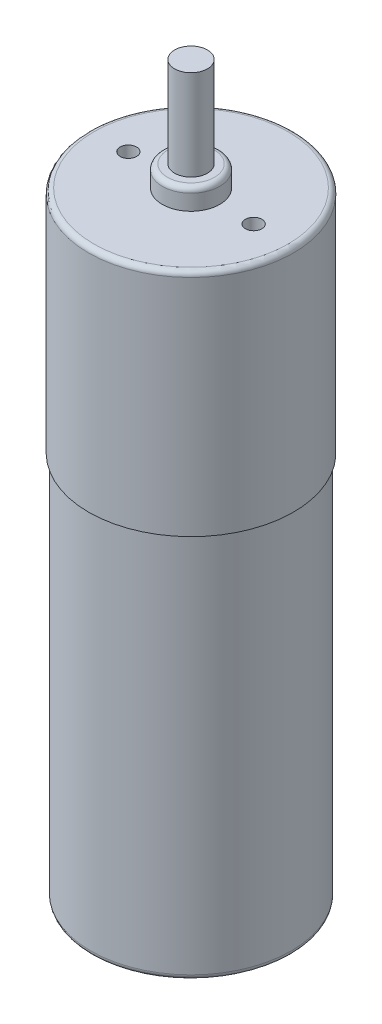
ISO-10303-21;
HEADER;
FILE_DESCRIPTION(('STEP AP214'),'2;1');
FILE_NAME('part.step','',(''),(''),'','','');
FILE_SCHEMA(('AUTOMOTIVE_DESIGN { 1 0 10303 214 1 1 1 1 }'));
ENDSEC;
DATA;
#1=APPLICATION_CONTEXT('core data for automotive mechanical design processes');
#2=APPLICATION_PROTOCOL_DEFINITION('international standard','automotive_design',2000,#1);
#3=PRODUCT_CONTEXT('',#1,'mechanical');
#4=PRODUCT('Part','Part','',(#3));
#5=PRODUCT_RELATED_PRODUCT_CATEGORY('part','',(#4));
#6=PRODUCT_DEFINITION_FORMATION('','',#4);
#7=PRODUCT_DEFINITION_CONTEXT('part definition',#1,'design');
#8=PRODUCT_DEFINITION('design','',#6,#7);
#9=PRODUCT_DEFINITION_SHAPE('','',#8);
#10=(LENGTH_UNIT() NAMED_UNIT(*) SI_UNIT(.MILLI.,.METRE.));
#11=(NAMED_UNIT(*) PLANE_ANGLE_UNIT() SI_UNIT($,.RADIAN.));
#12=(NAMED_UNIT(*) SI_UNIT($,.STERADIAN.) SOLID_ANGLE_UNIT());
#13=UNCERTAINTY_MEASURE_WITH_UNIT(LENGTH_MEASURE(1.E-05),#10,'distance_accuracy_value','');
#14=(GEOMETRIC_REPRESENTATION_CONTEXT(3) GLOBAL_UNCERTAINTY_ASSIGNED_CONTEXT((#13)) GLOBAL_UNIT_ASSIGNED_CONTEXT((#10,
#11,#12)) REPRESENTATION_CONTEXT('',''));
#15=CARTESIAN_POINT('',(0.,0.,0.));
#16=DIRECTION('',(0.,0.,1.));
#17=DIRECTION('',(1.,0.,0.));
#18=AXIS2_PLACEMENT_3D('',#15,#16,#17);
#19=CARTESIAN_POINT('',(0.,46.99,0.));
#20=DIRECTION('',(0.,-1.,0.));
#21=DIRECTION('',(0.,0.,-1.));
#22=AXIS2_PLACEMENT_3D('',#19,#20,#21);
#23=CYLINDRICAL_SURFACE('',#22,12.192);
#24=CARTESIAN_POINT('',(0.,0.634999999999997,0.));
#25=DIRECTION('',(0.,1.,0.));
#26=DIRECTION('',(0.,0.,1.));
#27=AXIS2_PLACEMENT_3D('',#24,#25,#26);
#28=CIRCLE('',#27,12.192);
#29=CARTESIAN_POINT('',(0.,0.634999999999997,12.192));
#30=VERTEX_POINT('',#29);
#31=EDGE_CURVE('E63',#30,#30,#28,.T.);
#32=ORIENTED_EDGE('',*,*,#31,.T.);
#33=EDGE_LOOP('',(#32));
#34=FACE_BOUND('',#33,.T.);
#35=CARTESIAN_POINT('',(0.,46.99,0.));
#36=DIRECTION('',(0.,1.,0.));
#37=DIRECTION('',(0.,0.,1.));
#38=AXIS2_PLACEMENT_3D('',#35,#36,#37);
#39=CIRCLE('',#38,12.192);
#40=CARTESIAN_POINT('',(0.,46.99,12.192));
#41=VERTEX_POINT('',#40);
#42=EDGE_CURVE('E78',#41,#41,#39,.T.);
#43=ORIENTED_EDGE('',*,*,#42,.F.);
#44=EDGE_LOOP('',(#43));
#45=FACE_BOUND('',#44,.T.);
#46=ADVANCED_FACE('F45',(#34,#45),#23,.T.);
#47=CARTESIAN_POINT('',(0.,0.,0.));
#48=DIRECTION('',(0.,1.,0.));
#49=DIRECTION('',(0.,0.,1.));
#50=AXIS2_PLACEMENT_3D('',#47,#48,#49);
#51=PLANE('',#50);
#52=CARTESIAN_POINT('',(0.,0.,0.));
#53=DIRECTION('',(0.,1.,0.));
#54=DIRECTION('',(0.,0.,1.));
#55=AXIS2_PLACEMENT_3D('',#52,#53,#54);
#56=CIRCLE('',#55,11.557);
#57=CARTESIAN_POINT('',(0.,0.,11.557));
#58=VERTEX_POINT('',#57);
#59=EDGE_CURVE('E58',#58,#58,#56,.F.);
#60=ORIENTED_EDGE('',*,*,#59,.T.);
#61=EDGE_LOOP('',(#60));
#62=FACE_BOUND('',#61,.T.);
#63=ADVANCED_FACE('F149',(#62),#51,.F.);
#64=CARTESIAN_POINT('',(0.,74.93,0.));
#65=DIRECTION('',(0.,-1.,0.));
#66=DIRECTION('',(0.,0.,-1.));
#67=AXIS2_PLACEMENT_3D('',#64,#65,#66);
#68=CYLINDRICAL_SURFACE('',#67,12.4587);
#69=CARTESIAN_POINT('',(0.,74.295,0.));
#70=DIRECTION('',(0.,1.,0.));
#71=DIRECTION('',(0.,0.,1.));
#72=AXIS2_PLACEMENT_3D('',#69,#70,#71);
#73=CIRCLE('',#72,12.4587);
#74=CARTESIAN_POINT('',(0.,74.295,12.4587));
#75=VERTEX_POINT('',#74);
#76=EDGE_CURVE('E69',#75,#75,#73,.F.);
#77=ORIENTED_EDGE('',*,*,#76,.T.);
#78=EDGE_LOOP('',(#77));
#79=FACE_BOUND('',#78,.T.);
#80=CARTESIAN_POINT('',(0.,46.99,0.));
#81=DIRECTION('',(0.,1.,0.));
#82=DIRECTION('',(0.,0.,1.));
#83=AXIS2_PLACEMENT_3D('',#80,#81,#82);
#84=CIRCLE('',#83,12.4587);
#85=CARTESIAN_POINT('',(0.,46.99,12.4587));
#86=VERTEX_POINT('',#85);
#87=EDGE_CURVE('E83',#86,#86,#84,.T.);
#88=ORIENTED_EDGE('',*,*,#87,.T.);
#89=EDGE_LOOP('',(#88));
#90=FACE_BOUND('',#89,.T.);
#91=ADVANCED_FACE('F127',(#79,#90),#68,.T.);
#92=CARTESIAN_POINT('',(0.,74.93,0.));
#93=DIRECTION('',(0.,1.,0.));
#94=DIRECTION('',(0.,0.,1.));
#95=AXIS2_PLACEMENT_3D('',#92,#93,#94);
#96=PLANE('',#95);
#97=CARTESIAN_POINT('',(7.62,74.93,0.));
#98=DIRECTION('',(0.,1.,0.));
#99=DIRECTION('',(0.,0.,1.));
#100=AXIS2_PLACEMENT_3D('',#97,#98,#99);
#101=CIRCLE('',#100,1.0033);
#102=CARTESIAN_POINT('',(7.62,74.93,1.0033));
#103=VERTEX_POINT('',#102);
#104=EDGE_CURVE('E106',#103,#103,#101,.T.);
#105=ORIENTED_EDGE('',*,*,#104,.F.);
#106=EDGE_LOOP('',(#105));
#107=FACE_BOUND('',#106,.T.);
#108=CARTESIAN_POINT('',(-7.62,74.93,0.));
#109=DIRECTION('',(0.,1.,0.));
#110=DIRECTION('',(0.,0.,-1.));
#111=AXIS2_PLACEMENT_3D('',#108,#109,#110);
#112=CIRCLE('',#111,1.0033);
#113=CARTESIAN_POINT('',(-7.62,74.93,-1.0033));
#114=VERTEX_POINT('',#113);
#115=EDGE_CURVE('E102',#114,#114,#112,.T.);
#116=ORIENTED_EDGE('',*,*,#115,.F.);
#117=EDGE_LOOP('',(#116));
#118=FACE_BOUND('',#117,.T.);
#119=CARTESIAN_POINT('',(0.,74.93,0.));
#120=DIRECTION('',(0.,1.,0.));
#121=DIRECTION('',(0.,0.,1.));
#122=AXIS2_PLACEMENT_3D('',#119,#120,#121);
#123=CIRCLE('',#122,11.8237);
#124=CARTESIAN_POINT('',(0.,74.93,11.8237));
#125=VERTEX_POINT('',#124);
#126=EDGE_CURVE('E73',#125,#125,#123,.T.);
#127=ORIENTED_EDGE('',*,*,#126,.T.);
#128=EDGE_LOOP('',(#127));
#129=FACE_BOUND('',#128,.T.);
#130=CARTESIAN_POINT('',(0.,74.93,0.));
#131=DIRECTION('',(0.,1.,0.));
#132=DIRECTION('',(0.,0.,1.));
#133=AXIS2_PLACEMENT_3D('',#130,#131,#132);
#134=CIRCLE('',#133,3.4925);
#135=CARTESIAN_POINT('',(0.,74.93,3.4925));
#136=VERTEX_POINT('',#135);
#137=EDGE_CURVE('E82',#136,#136,#134,.T.);
#138=ORIENTED_EDGE('',*,*,#137,.F.);
#139=EDGE_LOOP('',(#138));
#140=FACE_BOUND('',#139,.T.);
#141=ADVANCED_FACE('F123',(#107,#118,#129,#140),#96,.T.);
#142=CARTESIAN_POINT('',(0.,46.99,0.));
#143=DIRECTION('',(0.,1.,0.));
#144=DIRECTION('',(0.,0.,1.));
#145=AXIS2_PLACEMENT_3D('',#142,#143,#144);
#146=PLANE('',#145);
#147=ORIENTED_EDGE('',*,*,#42,.T.);
#148=EDGE_LOOP('',(#147));
#149=FACE_BOUND('',#148,.T.);
#150=ORIENTED_EDGE('',*,*,#87,.F.);
#151=EDGE_LOOP('',(#150));
#152=FACE_BOUND('',#151,.T.);
#153=ADVANCED_FACE('F126',(#149,#152),#146,.F.);
#154=CARTESIAN_POINT('',(0.,77.47,0.));
#155=DIRECTION('',(0.,-1.,0.));
#156=DIRECTION('',(0.,0.,-1.));
#157=AXIS2_PLACEMENT_3D('',#154,#155,#156);
#158=CYLINDRICAL_SURFACE('',#157,3.4925);
#159=CARTESIAN_POINT('',(0.,76.835,0.));
#160=DIRECTION('',(0.,1.,0.));
#161=DIRECTION('',(0.,0.,1.));
#162=AXIS2_PLACEMENT_3D('',#159,#160,#161);
#163=CIRCLE('',#162,3.4925);
#164=CARTESIAN_POINT('',(0.,76.835,3.4925));
#165=VERTEX_POINT('',#164);
#166=EDGE_CURVE('E10',#165,#165,#163,.F.);
#167=ORIENTED_EDGE('',*,*,#166,.T.);
#168=EDGE_LOOP('',(#167));
#169=FACE_BOUND('',#168,.T.);
#170=ORIENTED_EDGE('',*,*,#137,.T.);
#171=EDGE_LOOP('',(#170));
#172=FACE_BOUND('',#171,.T.);
#173=ADVANCED_FACE('F135',(#169,#172),#158,.T.);
#174=CARTESIAN_POINT('',(0.,77.47,0.));
#175=DIRECTION('',(0.,1.,0.));
#176=DIRECTION('',(0.,0.,1.));
#177=AXIS2_PLACEMENT_3D('',#174,#175,#176);
#178=PLANE('',#177);
#179=CARTESIAN_POINT('',(0.,77.47,0.));
#180=DIRECTION('',(0.,1.,0.));
#181=DIRECTION('',(0.,0.,1.));
#182=AXIS2_PLACEMENT_3D('',#179,#180,#181);
#183=CIRCLE('',#182,2.8575);
#184=CARTESIAN_POINT('',(0.,77.47,2.8575));
#185=VERTEX_POINT('',#184);
#186=EDGE_CURVE('E53',#185,#185,#183,.T.);
#187=ORIENTED_EDGE('',*,*,#186,.T.);
#188=EDGE_LOOP('',(#187));
#189=FACE_BOUND('',#188,.T.);
#190=CARTESIAN_POINT('',(0.,77.47,0.));
#191=DIRECTION('',(0.,1.,0.));
#192=DIRECTION('',(0.,0.,1.));
#193=AXIS2_PLACEMENT_3D('',#190,#191,#192);
#194=CIRCLE('',#193,1.9939);
#195=CARTESIAN_POINT('',(0.,77.47,1.9939));
#196=VERTEX_POINT('',#195);
#197=EDGE_CURVE('E77',#196,#196,#194,.T.);
#198=ORIENTED_EDGE('',*,*,#197,.F.);
#199=EDGE_LOOP('',(#198));
#200=FACE_BOUND('',#199,.T.);
#201=ADVANCED_FACE('F137',(#189,#200),#178,.T.);
#202=CARTESIAN_POINT('',(0.,88.4682,0.));
#203=DIRECTION('',(0.,-1.,0.));
#204=DIRECTION('',(0.,0.,-1.));
#205=AXIS2_PLACEMENT_3D('',#202,#203,#204);
#206=CYLINDRICAL_SURFACE('',#205,1.9939);
#207=CARTESIAN_POINT('',(0.,88.4682,0.));
#208=DIRECTION('',(0.,1.,0.));
#209=DIRECTION('',(0.,0.,1.));
#210=AXIS2_PLACEMENT_3D('',#207,#208,#209);
#211=CIRCLE('',#210,1.9939);
#212=CARTESIAN_POINT('',(0.,88.4682,1.9939));
#213=VERTEX_POINT('',#212);
#214=EDGE_CURVE('E87',#213,#213,#211,.T.);
#215=ORIENTED_EDGE('',*,*,#214,.F.);
#216=EDGE_LOOP('',(#215));
#217=FACE_BOUND('',#216,.T.);
#218=ORIENTED_EDGE('',*,*,#197,.T.);
#219=EDGE_LOOP('',(#218));
#220=FACE_BOUND('',#219,.T.);
#221=ADVANCED_FACE('F143',(#217,#220),#206,.T.);
#222=CARTESIAN_POINT('',(0.,88.4682,0.));
#223=DIRECTION('',(0.,1.,0.));
#224=DIRECTION('',(0.,0.,1.));
#225=AXIS2_PLACEMENT_3D('',#222,#223,#224);
#226=PLANE('',#225);
#227=ORIENTED_EDGE('',*,*,#214,.T.);
#228=EDGE_LOOP('',(#227));
#229=FACE_BOUND('',#228,.T.);
#230=ADVANCED_FACE('F164',(#229),#226,.T.);
#231=CARTESIAN_POINT('',(0.,74.295,0.));
#232=DIRECTION('',(0.,1.,0.));
#233=DIRECTION('',(0.,0.,1.));
#234=AXIS2_PLACEMENT_3D('',#231,#232,#233);
#235=TOROIDAL_SURFACE('',#234,11.8237,0.635);
#236=ORIENTED_EDGE('',*,*,#76,.F.);
#237=EDGE_LOOP('',(#236));
#238=FACE_BOUND('',#237,.T.);
#239=ORIENTED_EDGE('',*,*,#126,.F.);
#240=EDGE_LOOP('',(#239));
#241=FACE_BOUND('',#240,.T.);
#242=ADVANCED_FACE('F161',(#238,#241),#235,.T.);
#243=CARTESIAN_POINT('',(0.,0.634999999999997,0.));
#244=DIRECTION('',(0.,1.,0.));
#245=DIRECTION('',(0.,0.,1.));
#246=AXIS2_PLACEMENT_3D('',#243,#244,#245);
#247=TOROIDAL_SURFACE('',#246,11.557,0.635);
#248=ORIENTED_EDGE('',*,*,#59,.F.);
#249=EDGE_LOOP('',(#248));
#250=FACE_BOUND('',#249,.T.);
#251=ORIENTED_EDGE('',*,*,#31,.F.);
#252=EDGE_LOOP('',(#251));
#253=FACE_BOUND('',#252,.T.);
#254=ADVANCED_FACE('F163',(#250,#253),#247,.T.);
#255=CARTESIAN_POINT('',(0.,76.835,0.));
#256=DIRECTION('',(0.,1.,0.));
#257=DIRECTION('',(0.,0.,1.));
#258=AXIS2_PLACEMENT_3D('',#255,#256,#257);
#259=TOROIDAL_SURFACE('',#258,2.8575,0.635);
#260=ORIENTED_EDGE('',*,*,#166,.F.);
#261=EDGE_LOOP('',(#260));
#262=FACE_BOUND('',#261,.T.);
#263=ORIENTED_EDGE('',*,*,#186,.F.);
#264=EDGE_LOOP('',(#263));
#265=FACE_BOUND('',#264,.T.);
#266=ADVANCED_FACE('F47',(#262,#265),#259,.T.);
#267=CARTESIAN_POINT('',(-7.62,62.23,0.));
#268=DIRECTION('',(0.,1.,0.));
#269=DIRECTION('',(0.,0.,1.));
#270=AXIS2_PLACEMENT_3D('',#267,#268,#269);
#271=CYLINDRICAL_SURFACE('',#270,1.0033);
#272=CARTESIAN_POINT('',(-7.62,62.23,0.));
#273=DIRECTION('',(0.,1.,0.));
#274=DIRECTION('',(0.,0.,-1.));
#275=AXIS2_PLACEMENT_3D('',#272,#273,#274);
#276=CIRCLE('',#275,1.0033);
#277=CARTESIAN_POINT('',(-7.62,62.23,-1.0033));
#278=VERTEX_POINT('',#277);
#279=EDGE_CURVE('E98',#278,#278,#276,.T.);
#280=ORIENTED_EDGE('',*,*,#279,.F.);
#281=EDGE_LOOP('',(#280));
#282=FACE_BOUND('',#281,.T.);
#283=ORIENTED_EDGE('',*,*,#115,.T.);
#284=EDGE_LOOP('',(#283));
#285=FACE_BOUND('',#284,.T.);
#286=ADVANCED_FACE('F170',(#282,#285),#271,.F.);
#287=CARTESIAN_POINT('',(-7.62,62.23,0.));
#288=DIRECTION('',(0.,-1.,0.));
#289=DIRECTION('',(0.,0.,-1.));
#290=AXIS2_PLACEMENT_3D('',#287,#288,#289);
#291=PLANE('',#290);
#292=ORIENTED_EDGE('',*,*,#279,.T.);
#293=EDGE_LOOP('',(#292));
#294=FACE_BOUND('',#293,.T.);
#295=ADVANCED_FACE('F119',(#294),#291,.F.);
#296=CARTESIAN_POINT('',(7.62,62.23,0.));
#297=DIRECTION('',(0.,1.,0.));
#298=DIRECTION('',(0.,0.,1.));
#299=AXIS2_PLACEMENT_3D('',#296,#297,#298);
#300=CYLINDRICAL_SURFACE('',#299,1.0033);
#301=CARTESIAN_POINT('',(7.62,62.23,0.));
#302=DIRECTION('',(0.,1.,0.));
#303=DIRECTION('',(0.,0.,1.));
#304=AXIS2_PLACEMENT_3D('',#301,#302,#303);
#305=CIRCLE('',#304,1.0033);
#306=CARTESIAN_POINT('',(7.62,62.23,1.0033));
#307=VERTEX_POINT('',#306);
#308=EDGE_CURVE('E97',#307,#307,#305,.T.);
#309=ORIENTED_EDGE('',*,*,#308,.F.);
#310=EDGE_LOOP('',(#309));
#311=FACE_BOUND('',#310,.T.);
#312=ORIENTED_EDGE('',*,*,#104,.T.);
#313=EDGE_LOOP('',(#312));
#314=FACE_BOUND('',#313,.T.);
#315=ADVANCED_FACE('F116',(#311,#314),#300,.F.);
#316=CARTESIAN_POINT('',(7.62,62.23,0.));
#317=DIRECTION('',(0.,1.,0.));
#318=DIRECTION('',(0.,0.,1.));
#319=AXIS2_PLACEMENT_3D('',#316,#317,#318);
#320=PLANE('',#319);
#321=ORIENTED_EDGE('',*,*,#308,.T.);
#322=EDGE_LOOP('',(#321));
#323=FACE_BOUND('',#322,.T.);
#324=ADVANCED_FACE('F114',(#323),#320,.T.);
#325=CLOSED_SHELL('',(#46,#63,#91,#141,#153,#173,#201,#221,#230,#242,#254,#266,#286,#295,#315,#324));
#326=MANIFOLD_SOLID_BREP('B2',#325);
#327=ADVANCED_BREP_SHAPE_REPRESENTATION('',(#18,#326),#14);
#328=SHAPE_DEFINITION_REPRESENTATION(#9,#327);
ENDSEC;
END-ISO-10303-21;
